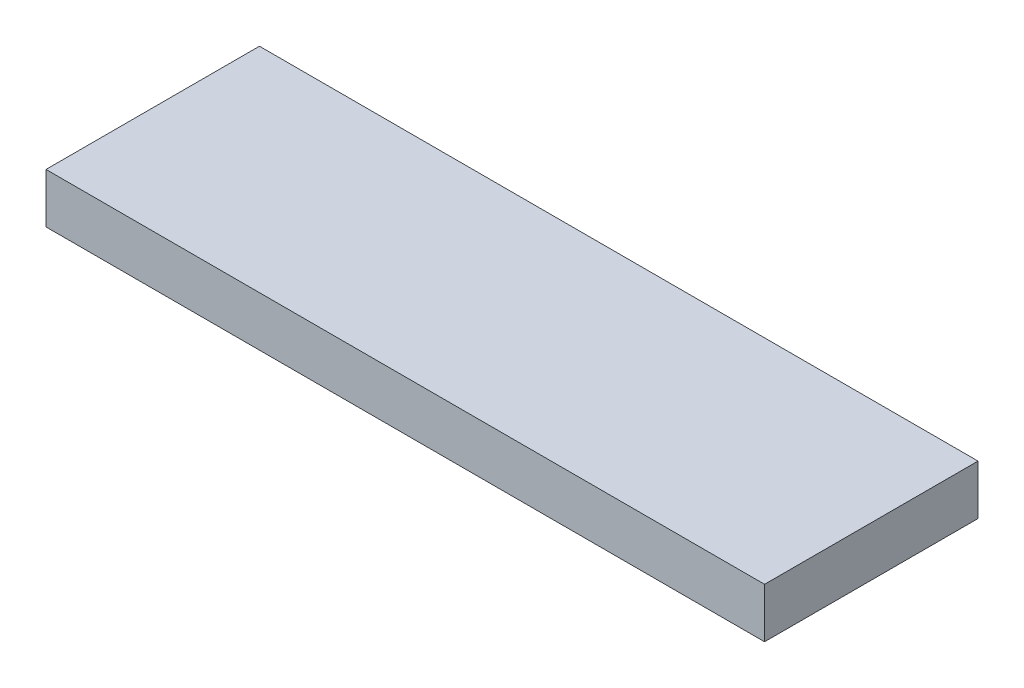
ISO-10303-21;
HEADER;
FILE_DESCRIPTION(('STEP AP214'),'2;1');
FILE_NAME('part.step','',(''),(''),'','','');
FILE_SCHEMA(('AUTOMOTIVE_DESIGN { 1 0 10303 214 1 1 1 1 }'));
ENDSEC;
DATA;
#1=APPLICATION_CONTEXT('core data for automotive mechanical design processes');
#2=APPLICATION_PROTOCOL_DEFINITION('international standard','automotive_design',2000,#1);
#3=PRODUCT_CONTEXT('',#1,'mechanical');
#4=PRODUCT('Part','Part','',(#3));
#5=PRODUCT_RELATED_PRODUCT_CATEGORY('part','',(#4));
#6=PRODUCT_DEFINITION_FORMATION('','',#4);
#7=PRODUCT_DEFINITION_CONTEXT('part definition',#1,'design');
#8=PRODUCT_DEFINITION('design','',#6,#7);
#9=PRODUCT_DEFINITION_SHAPE('','',#8);
#10=(LENGTH_UNIT() NAMED_UNIT(*) SI_UNIT(.MILLI.,.METRE.));
#11=(NAMED_UNIT(*) PLANE_ANGLE_UNIT() SI_UNIT($,.RADIAN.));
#12=(NAMED_UNIT(*) SI_UNIT($,.STERADIAN.) SOLID_ANGLE_UNIT());
#13=UNCERTAINTY_MEASURE_WITH_UNIT(LENGTH_MEASURE(1.E-05),#10,'distance_accuracy_value','');
#14=(GEOMETRIC_REPRESENTATION_CONTEXT(3) GLOBAL_UNCERTAINTY_ASSIGNED_CONTEXT((#13)) GLOBAL_UNIT_ASSIGNED_CONTEXT((#10,
#11,#12)) REPRESENTATION_CONTEXT('',''));
#15=CARTESIAN_POINT('',(0.,0.,0.));
#16=DIRECTION('',(0.,0.,1.));
#17=DIRECTION('',(1.,0.,0.));
#18=AXIS2_PLACEMENT_3D('',#15,#16,#17);
#19=CARTESIAN_POINT('',(538.999999999999,-40.,-17.5));
#20=DIRECTION('',(0.,-1.,0.));
#21=DIRECTION('',(0.,0.,-1.));
#22=AXIS2_PLACEMENT_3D('',#19,#20,#21);
#23=CYLINDRICAL_SURFACE('',#22,4.);
#24=CARTESIAN_POINT('',(538.999999999999,-40.,-17.5));
#25=DIRECTION('',(0.,-1.,0.));
#26=DIRECTION('',(0.,0.,-1.));
#27=AXIS2_PLACEMENT_3D('',#24,#25,#26);
#28=CIRCLE('',#27,4.);
#29=CARTESIAN_POINT('',(538.999999999999,-40.,-21.5));
#30=VERTEX_POINT('',#29);
#31=EDGE_CURVE('E104',#30,#30,#28,.F.);
#32=ORIENTED_EDGE('',*,*,#31,.F.);
#33=EDGE_LOOP('',(#32));
#34=FACE_BOUND('',#33,.T.);
#35=CARTESIAN_POINT('',(538.999999999999,-30.,-17.5));
#36=DIRECTION('',(0.,-1.,0.));
#37=DIRECTION('',(0.,0.,-1.));
#38=AXIS2_PLACEMENT_3D('',#35,#36,#37);
#39=CIRCLE('',#38,4.);
#40=CARTESIAN_POINT('',(538.999999999999,-30.,-21.5));
#41=VERTEX_POINT('',#40);
#42=EDGE_CURVE('E45',#41,#41,#39,.T.);
#43=ORIENTED_EDGE('',*,*,#42,.F.);
#44=EDGE_LOOP('',(#43));
#45=FACE_BOUND('',#44,.T.);
#46=ADVANCED_FACE('F42',(#34,#45),#23,.F.);
#47=CARTESIAN_POINT('',(538.999999999999,-40.,17.5000000000004));
#48=DIRECTION('',(0.,-1.,0.));
#49=DIRECTION('',(0.,0.,-1.));
#50=AXIS2_PLACEMENT_3D('',#47,#48,#49);
#51=CYLINDRICAL_SURFACE('',#50,4.);
#52=CARTESIAN_POINT('',(538.999999999999,-40.,17.5000000000004));
#53=DIRECTION('',(0.,-1.,0.));
#54=DIRECTION('',(0.,0.,-1.));
#55=AXIS2_PLACEMENT_3D('',#52,#53,#54);
#56=CIRCLE('',#55,4.);
#57=CARTESIAN_POINT('',(538.999999999999,-40.,13.5000000000004));
#58=VERTEX_POINT('',#57);
#59=EDGE_CURVE('E140',#58,#58,#56,.F.);
#60=ORIENTED_EDGE('',*,*,#59,.F.);
#61=EDGE_LOOP('',(#60));
#62=FACE_BOUND('',#61,.T.);
#63=CARTESIAN_POINT('',(538.999999999999,-30.,17.5000000000004));
#64=DIRECTION('',(0.,-1.,0.));
#65=DIRECTION('',(0.,0.,-1.));
#66=AXIS2_PLACEMENT_3D('',#63,#64,#65);
#67=CIRCLE('',#66,4.);
#68=CARTESIAN_POINT('',(538.999999999999,-30.,13.5000000000004));
#69=VERTEX_POINT('',#68);
#70=EDGE_CURVE('E155',#69,#69,#67,.T.);
#71=ORIENTED_EDGE('',*,*,#70,.F.);
#72=EDGE_LOOP('',(#71));
#73=FACE_BOUND('',#72,.T.);
#74=ADVANCED_FACE('F165',(#62,#73),#51,.F.);
#75=CARTESIAN_POINT('',(469.,-40.,-17.5));
#76=DIRECTION('',(0.,-1.,0.));
#77=DIRECTION('',(0.,0.,-1.));
#78=AXIS2_PLACEMENT_3D('',#75,#76,#77);
#79=CYLINDRICAL_SURFACE('',#78,3.40000000000001);
#80=CARTESIAN_POINT('',(469.,-40.,-17.5));
#81=DIRECTION('',(0.,-1.,0.));
#82=DIRECTION('',(0.,0.,-1.));
#83=AXIS2_PLACEMENT_3D('',#80,#81,#82);
#84=CIRCLE('',#83,3.40000000000001);
#85=CARTESIAN_POINT('',(469.,-40.,-20.9));
#86=VERTEX_POINT('',#85);
#87=EDGE_CURVE('E137',#86,#86,#84,.F.);
#88=ORIENTED_EDGE('',*,*,#87,.F.);
#89=EDGE_LOOP('',(#88));
#90=FACE_BOUND('',#89,.T.);
#91=CARTESIAN_POINT('',(469.,-30.,-17.5));
#92=DIRECTION('',(0.,-1.,0.));
#93=DIRECTION('',(0.,0.,-1.));
#94=AXIS2_PLACEMENT_3D('',#91,#92,#93);
#95=CIRCLE('',#94,3.40000000000001);
#96=CARTESIAN_POINT('',(469.,-30.,-20.9));
#97=VERTEX_POINT('',#96);
#98=EDGE_CURVE('E153',#97,#97,#95,.T.);
#99=ORIENTED_EDGE('',*,*,#98,.F.);
#100=EDGE_LOOP('',(#99));
#101=FACE_BOUND('',#100,.T.);
#102=ADVANCED_FACE('F170',(#90,#101),#79,.F.);
#103=CARTESIAN_POINT('',(609.,-40.,-17.5));
#104=DIRECTION('',(0.,-1.,0.));
#105=DIRECTION('',(0.,0.,-1.));
#106=AXIS2_PLACEMENT_3D('',#103,#104,#105);
#107=CYLINDRICAL_SURFACE('',#106,3.39999999999996);
#108=CARTESIAN_POINT('',(609.,-40.,-17.5));
#109=DIRECTION('',(0.,-1.,0.));
#110=DIRECTION('',(0.,0.,-1.));
#111=AXIS2_PLACEMENT_3D('',#108,#109,#110);
#112=CIRCLE('',#111,3.39999999999996);
#113=CARTESIAN_POINT('',(609.,-40.,-20.9));
#114=VERTEX_POINT('',#113);
#115=EDGE_CURVE('E134',#114,#114,#112,.F.);
#116=ORIENTED_EDGE('',*,*,#115,.F.);
#117=EDGE_LOOP('',(#116));
#118=FACE_BOUND('',#117,.T.);
#119=CARTESIAN_POINT('',(609.,-30.,-17.5));
#120=DIRECTION('',(0.,-1.,0.));
#121=DIRECTION('',(0.,0.,-1.));
#122=AXIS2_PLACEMENT_3D('',#119,#120,#121);
#123=CIRCLE('',#122,3.39999999999996);
#124=CARTESIAN_POINT('',(609.,-30.,-20.9));
#125=VERTEX_POINT('',#124);
#126=EDGE_CURVE('E150',#125,#125,#123,.T.);
#127=ORIENTED_EDGE('',*,*,#126,.F.);
#128=EDGE_LOOP('',(#127));
#129=FACE_BOUND('',#128,.T.);
#130=ADVANCED_FACE('F203',(#118,#129),#107,.F.);
#131=CARTESIAN_POINT('',(609.,-40.,17.5));
#132=DIRECTION('',(0.,-1.,0.));
#133=DIRECTION('',(0.,0.,-1.));
#134=AXIS2_PLACEMENT_3D('',#131,#132,#133);
#135=CYLINDRICAL_SURFACE('',#134,3.39999999999996);
#136=CARTESIAN_POINT('',(609.,-40.,17.5));
#137=DIRECTION('',(0.,-1.,0.));
#138=DIRECTION('',(0.,0.,-1.));
#139=AXIS2_PLACEMENT_3D('',#136,#137,#138);
#140=CIRCLE('',#139,3.39999999999996);
#141=CARTESIAN_POINT('',(609.,-40.,14.1));
#142=VERTEX_POINT('',#141);
#143=EDGE_CURVE('E131',#142,#142,#140,.F.);
#144=ORIENTED_EDGE('',*,*,#143,.F.);
#145=EDGE_LOOP('',(#144));
#146=FACE_BOUND('',#145,.T.);
#147=CARTESIAN_POINT('',(609.,-30.,17.5));
#148=DIRECTION('',(0.,-1.,0.));
#149=DIRECTION('',(0.,0.,-1.));
#150=AXIS2_PLACEMENT_3D('',#147,#148,#149);
#151=CIRCLE('',#150,3.39999999999996);
#152=CARTESIAN_POINT('',(609.,-30.,14.1));
#153=VERTEX_POINT('',#152);
#154=EDGE_CURVE('E147',#153,#153,#151,.T.);
#155=ORIENTED_EDGE('',*,*,#154,.F.);
#156=EDGE_LOOP('',(#155));
#157=FACE_BOUND('',#156,.T.);
#158=ADVANCED_FACE('F199',(#146,#157),#135,.F.);
#159=CARTESIAN_POINT('',(469.,-40.,17.5));
#160=DIRECTION('',(0.,-1.,0.));
#161=DIRECTION('',(0.,0.,-1.));
#162=AXIS2_PLACEMENT_3D('',#159,#160,#161);
#163=CYLINDRICAL_SURFACE('',#162,3.40000000000001);
#164=CARTESIAN_POINT('',(469.,-40.,17.5));
#165=DIRECTION('',(0.,-1.,0.));
#166=DIRECTION('',(0.,0.,-1.));
#167=AXIS2_PLACEMENT_3D('',#164,#165,#166);
#168=CIRCLE('',#167,3.40000000000001);
#169=CARTESIAN_POINT('',(469.,-40.,14.1));
#170=VERTEX_POINT('',#169);
#171=EDGE_CURVE('E123',#170,#170,#168,.F.);
#172=ORIENTED_EDGE('',*,*,#171,.F.);
#173=EDGE_LOOP('',(#172));
#174=FACE_BOUND('',#173,.T.);
#175=CARTESIAN_POINT('',(469.,-30.,17.5));
#176=DIRECTION('',(0.,-1.,0.));
#177=DIRECTION('',(0.,0.,-1.));
#178=AXIS2_PLACEMENT_3D('',#175,#176,#177);
#179=CIRCLE('',#178,3.40000000000001);
#180=CARTESIAN_POINT('',(469.,-30.,14.1));
#181=VERTEX_POINT('',#180);
#182=EDGE_CURVE('E128',#181,#181,#179,.T.);
#183=ORIENTED_EDGE('',*,*,#182,.F.);
#184=EDGE_LOOP('',(#183));
#185=FACE_BOUND('',#184,.T.);
#186=ADVANCED_FACE('F196',(#174,#185),#163,.F.);
#187=CARTESIAN_POINT('',(640.,-40.,-30.));
#188=DIRECTION('',(-1.,0.,0.));
#189=DIRECTION('',(0.,0.,1.));
#190=AXIS2_PLACEMENT_3D('',#187,#188,#189);
#191=PLANE('',#190);
#192=DIRECTION('',(0.,1.,0.));
#193=VECTOR('',#192,1.);
#194=CARTESIAN_POINT('',(640.,-40.,30.));
#195=LINE('',#194,#193);
#196=CARTESIAN_POINT('',(640.,-26.,30.));
#197=VERTEX_POINT('',#196);
#198=CARTESIAN_POINT('',(640.,-40.,30.));
#199=VERTEX_POINT('',#198);
#200=EDGE_CURVE('E86',#197,#199,#195,.F.);
#201=ORIENTED_EDGE('',*,*,#200,.T.);
#202=DIRECTION('',(0.,0.,-1.));
#203=VECTOR('',#202,1.);
#204=CARTESIAN_POINT('',(640.,-40.,0.));
#205=LINE('',#204,#203);
#206=CARTESIAN_POINT('',(640.,-40.,-30.));
#207=VERTEX_POINT('',#206);
#208=EDGE_CURVE('E76',#207,#199,#205,.F.);
#209=ORIENTED_EDGE('',*,*,#208,.F.);
#210=DIRECTION('',(0.,1.,0.));
#211=VECTOR('',#210,1.);
#212=CARTESIAN_POINT('',(640.,-40.,-30.));
#213=LINE('',#212,#211);
#214=CARTESIAN_POINT('',(640.,-26.,-30.));
#215=VERTEX_POINT('',#214);
#216=EDGE_CURVE('E98',#207,#215,#213,.T.);
#217=ORIENTED_EDGE('',*,*,#216,.T.);
#218=DIRECTION('',(0.,0.,-1.));
#219=VECTOR('',#218,1.);
#220=CARTESIAN_POINT('',(640.,-26.,30.));
#221=LINE('',#220,#219);
#222=EDGE_CURVE('E102',#197,#215,#221,.T.);
#223=ORIENTED_EDGE('',*,*,#222,.F.);
#224=EDGE_LOOP('',(#201,#209,#217,#223));
#225=FACE_BOUND('',#224,.T.);
#226=ADVANCED_FACE('F100',(#225),#191,.F.);
#227=CARTESIAN_POINT('',(640.,-40.,30.));
#228=DIRECTION('',(0.,0.,-1.));
#229=DIRECTION('',(-1.,0.,0.));
#230=AXIS2_PLACEMENT_3D('',#227,#228,#229);
#231=PLANE('',#230);
#232=DIRECTION('',(0.,1.,0.));
#233=VECTOR('',#232,1.);
#234=CARTESIAN_POINT('',(438.,-40.,30.));
#235=LINE('',#234,#233);
#236=CARTESIAN_POINT('',(438.,-26.,30.));
#237=VERTEX_POINT('',#236);
#238=CARTESIAN_POINT('',(438.,-40.,30.));
#239=VERTEX_POINT('',#238);
#240=EDGE_CURVE('E90',#237,#239,#235,.F.);
#241=ORIENTED_EDGE('',*,*,#240,.T.);
#242=DIRECTION('',(1.,0.,0.));
#243=VECTOR('',#242,1.);
#244=CARTESIAN_POINT('',(0.,-40.,30.));
#245=LINE('',#244,#243);
#246=EDGE_CURVE('E120',#199,#239,#245,.F.);
#247=ORIENTED_EDGE('',*,*,#246,.F.);
#248=ORIENTED_EDGE('',*,*,#200,.F.);
#249=DIRECTION('',(1.,0.,0.));
#250=VECTOR('',#249,1.);
#251=CARTESIAN_POINT('',(438.,-26.,30.));
#252=LINE('',#251,#250);
#253=EDGE_CURVE('E113',#237,#197,#252,.T.);
#254=ORIENTED_EDGE('',*,*,#253,.F.);
#255=EDGE_LOOP('',(#241,#247,#248,#254));
#256=FACE_BOUND('',#255,.T.);
#257=ADVANCED_FACE('F191',(#256),#231,.F.);
#258=CARTESIAN_POINT('',(438.,-40.,-30.0000000000001));
#259=DIRECTION('',(1.,0.,0.));
#260=DIRECTION('',(0.,0.,-1.));
#261=AXIS2_PLACEMENT_3D('',#258,#259,#260);
#262=PLANE('',#261);
#263=DIRECTION('',(0.,1.,0.));
#264=VECTOR('',#263,1.);
#265=CARTESIAN_POINT('',(438.,-40.,-30.0000000000001));
#266=LINE('',#265,#264);
#267=CARTESIAN_POINT('',(438.,-26.,-30.0000000000001));
#268=VERTEX_POINT('',#267);
#269=CARTESIAN_POINT('',(438.,-40.,-30.0000000000001));
#270=VERTEX_POINT('',#269);
#271=EDGE_CURVE('E63',#268,#270,#266,.F.);
#272=ORIENTED_EDGE('',*,*,#271,.T.);
#273=DIRECTION('',(0.,0.,-1.));
#274=VECTOR('',#273,1.);
#275=CARTESIAN_POINT('',(438.,-40.,0.));
#276=LINE('',#275,#274);
#277=EDGE_CURVE('E51',#239,#270,#276,.T.);
#278=ORIENTED_EDGE('',*,*,#277,.F.);
#279=ORIENTED_EDGE('',*,*,#240,.F.);
#280=DIRECTION('',(0.,0.,1.));
#281=VECTOR('',#280,1.);
#282=CARTESIAN_POINT('',(438.,-26.,-30.0000000000001));
#283=LINE('',#282,#281);
#284=EDGE_CURVE('E110',#268,#237,#283,.T.);
#285=ORIENTED_EDGE('',*,*,#284,.F.);
#286=EDGE_LOOP('',(#272,#278,#279,#285));
#287=FACE_BOUND('',#286,.T.);
#288=ADVANCED_FACE('F184',(#287),#262,.F.);
#289=CARTESIAN_POINT('',(640.,-40.,-30.));
#290=DIRECTION('',(0.,0.,1.));
#291=DIRECTION('',(1.,0.,0.));
#292=AXIS2_PLACEMENT_3D('',#289,#290,#291);
#293=PLANE('',#292);
#294=ORIENTED_EDGE('',*,*,#216,.F.);
#295=DIRECTION('',(1.,0.,0.));
#296=VECTOR('',#295,1.);
#297=CARTESIAN_POINT('',(0.,-40.,-30.0000000000001));
#298=LINE('',#297,#296);
#299=EDGE_CURVE('E11',#270,#207,#298,.T.);
#300=ORIENTED_EDGE('',*,*,#299,.F.);
#301=ORIENTED_EDGE('',*,*,#271,.F.);
#302=DIRECTION('',(-1.,0.,0.));
#303=VECTOR('',#302,1.);
#304=CARTESIAN_POINT('',(640.,-26.,-30.));
#305=LINE('',#304,#303);
#306=EDGE_CURVE('E107',#215,#268,#305,.T.);
#307=ORIENTED_EDGE('',*,*,#306,.F.);
#308=EDGE_LOOP('',(#294,#300,#301,#307));
#309=FACE_BOUND('',#308,.T.);
#310=ADVANCED_FACE('F108',(#309),#293,.F.);
#311=CARTESIAN_POINT('',(0.,-40.,0.));
#312=DIRECTION('',(0.,-1.,0.));
#313=DIRECTION('',(0.,0.,-1.));
#314=AXIS2_PLACEMENT_3D('',#311,#312,#313);
#315=PLANE('',#314);
#316=ORIENTED_EDGE('',*,*,#277,.T.);
#317=ORIENTED_EDGE('',*,*,#299,.T.);
#318=ORIENTED_EDGE('',*,*,#208,.T.);
#319=ORIENTED_EDGE('',*,*,#246,.T.);
#320=EDGE_LOOP('',(#316,#317,#318,#319));
#321=FACE_BOUND('',#320,.T.);
#322=ORIENTED_EDGE('',*,*,#171,.T.);
#323=EDGE_LOOP('',(#322));
#324=FACE_BOUND('',#323,.T.);
#325=ORIENTED_EDGE('',*,*,#143,.T.);
#326=EDGE_LOOP('',(#325));
#327=FACE_BOUND('',#326,.T.);
#328=ORIENTED_EDGE('',*,*,#115,.T.);
#329=EDGE_LOOP('',(#328));
#330=FACE_BOUND('',#329,.T.);
#331=ORIENTED_EDGE('',*,*,#87,.T.);
#332=EDGE_LOOP('',(#331));
#333=FACE_BOUND('',#332,.T.);
#334=ORIENTED_EDGE('',*,*,#59,.T.);
#335=EDGE_LOOP('',(#334));
#336=FACE_BOUND('',#335,.T.);
#337=ORIENTED_EDGE('',*,*,#31,.T.);
#338=EDGE_LOOP('',(#337));
#339=FACE_BOUND('',#338,.T.);
#340=ADVANCED_FACE('F175',(#321,#324,#327,#330,#333,#336,#339),#315,.T.);
#341=CARTESIAN_POINT('',(0.,-30.,0.));
#342=DIRECTION('',(0.,1.,0.));
#343=DIRECTION('',(0.,0.,1.));
#344=AXIS2_PLACEMENT_3D('',#341,#342,#343);
#345=PLANE('',#344);
#346=ORIENTED_EDGE('',*,*,#42,.T.);
#347=EDGE_LOOP('',(#346));
#348=FACE_BOUND('',#347,.T.);
#349=ADVANCED_FACE('F162',(#348),#345,.F.);
#350=ORIENTED_EDGE('',*,*,#70,.T.);
#351=EDGE_LOOP('',(#350));
#352=FACE_BOUND('',#351,.T.);
#353=ADVANCED_FACE('F174',(#352),#345,.F.);
#354=ORIENTED_EDGE('',*,*,#98,.T.);
#355=EDGE_LOOP('',(#354));
#356=FACE_BOUND('',#355,.T.);
#357=ADVANCED_FACE('F216',(#356),#345,.F.);
#358=ORIENTED_EDGE('',*,*,#126,.T.);
#359=EDGE_LOOP('',(#358));
#360=FACE_BOUND('',#359,.T.);
#361=ADVANCED_FACE('F218',(#360),#345,.F.);
#362=ORIENTED_EDGE('',*,*,#154,.T.);
#363=EDGE_LOOP('',(#362));
#364=FACE_BOUND('',#363,.T.);
#365=ADVANCED_FACE('F223',(#364),#345,.F.);
#366=ORIENTED_EDGE('',*,*,#182,.T.);
#367=EDGE_LOOP('',(#366));
#368=FACE_BOUND('',#367,.T.);
#369=ADVANCED_FACE('F177',(#368),#345,.F.);
#370=CARTESIAN_POINT('',(0.,-26.,0.));
#371=DIRECTION('',(0.,1.,0.));
#372=DIRECTION('',(0.,0.,1.));
#373=AXIS2_PLACEMENT_3D('',#370,#371,#372);
#374=PLANE('',#373);
#375=ORIENTED_EDGE('',*,*,#222,.T.);
#376=ORIENTED_EDGE('',*,*,#306,.T.);
#377=ORIENTED_EDGE('',*,*,#284,.T.);
#378=ORIENTED_EDGE('',*,*,#253,.T.);
#379=EDGE_LOOP('',(#375,#376,#377,#378));
#380=FACE_BOUND('',#379,.T.);
#381=ADVANCED_FACE('F112',(#380),#374,.T.);
#382=CLOSED_SHELL('',(#46,#74,#102,#130,#158,#186,#226,#257,#288,#310,#340,#349,#353,#357,#361,
#365,#369,#381));
#383=MANIFOLD_SOLID_BREP('B2',#382);
#384=ADVANCED_BREP_SHAPE_REPRESENTATION('',(#18,#383),#14);
#385=SHAPE_DEFINITION_REPRESENTATION(#9,#384);
ENDSEC;
END-ISO-10303-21;
